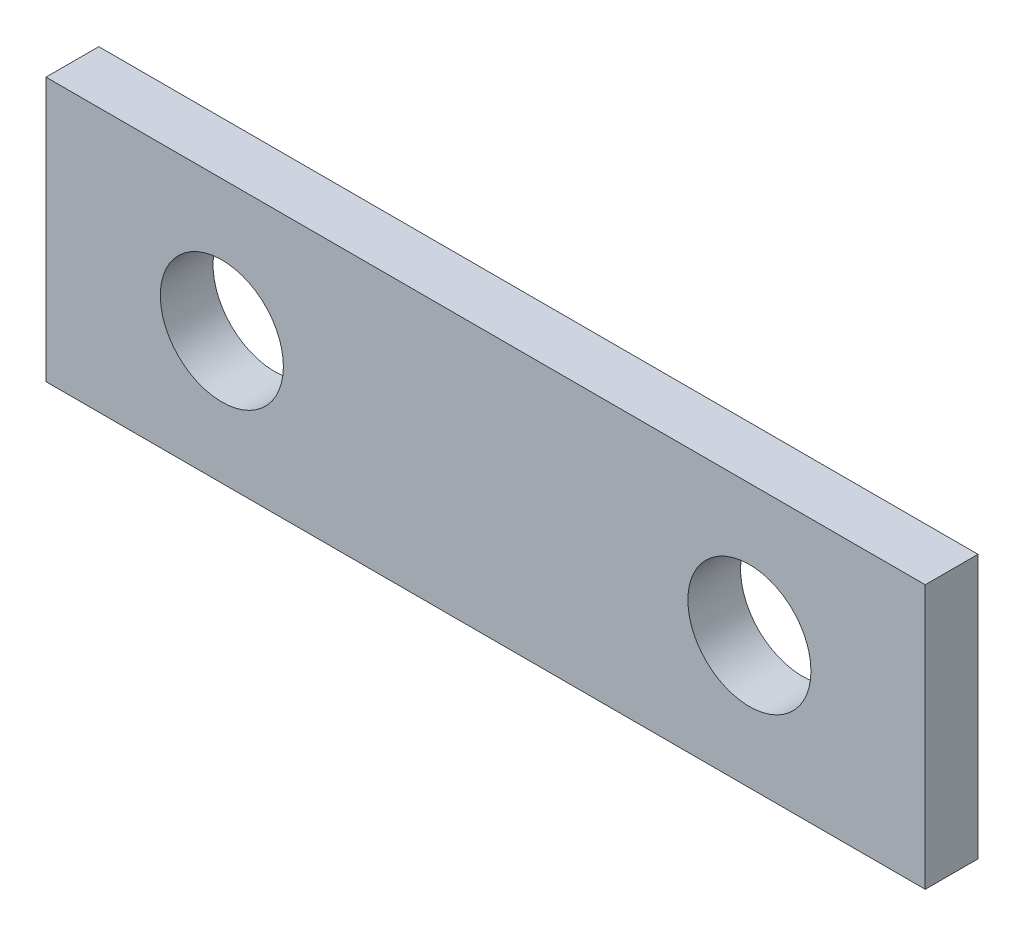
ISO-10303-21;
HEADER;
FILE_DESCRIPTION(('STEP AP214'),'2;1');
FILE_NAME('part.step','',(''),(''),'','','');
FILE_SCHEMA(('AUTOMOTIVE_DESIGN { 1 0 10303 214 1 1 1 1 }'));
ENDSEC;
DATA;
#1=APPLICATION_CONTEXT('core data for automotive mechanical design processes');
#2=APPLICATION_PROTOCOL_DEFINITION('international standard','automotive_design',2000,#1);
#3=PRODUCT_CONTEXT('',#1,'mechanical');
#4=PRODUCT('Part','Part','',(#3));
#5=PRODUCT_RELATED_PRODUCT_CATEGORY('part','',(#4));
#6=PRODUCT_DEFINITION_FORMATION('','',#4);
#7=PRODUCT_DEFINITION_CONTEXT('part definition',#1,'design');
#8=PRODUCT_DEFINITION('design','',#6,#7);
#9=PRODUCT_DEFINITION_SHAPE('','',#8);
#10=(LENGTH_UNIT() NAMED_UNIT(*) SI_UNIT(.MILLI.,.METRE.));
#11=(NAMED_UNIT(*) PLANE_ANGLE_UNIT() SI_UNIT($,.RADIAN.));
#12=(NAMED_UNIT(*) SI_UNIT($,.STERADIAN.) SOLID_ANGLE_UNIT());
#13=UNCERTAINTY_MEASURE_WITH_UNIT(LENGTH_MEASURE(1.E-05),#10,'distance_accuracy_value','');
#14=(GEOMETRIC_REPRESENTATION_CONTEXT(3) GLOBAL_UNCERTAINTY_ASSIGNED_CONTEXT((#13)) GLOBAL_UNIT_ASSIGNED_CONTEXT((#10,
#11,#12)) REPRESENTATION_CONTEXT('',''));
#15=CARTESIAN_POINT('',(0.,0.,0.));
#16=DIRECTION('',(0.,0.,1.));
#17=DIRECTION('',(1.,0.,0.));
#18=AXIS2_PLACEMENT_3D('',#15,#16,#17);
#19=CARTESIAN_POINT('',(0.,0.,6.));
#20=DIRECTION('',(0.,0.,-1.));
#21=DIRECTION('',(-1.,0.,0.));
#22=AXIS2_PLACEMENT_3D('',#19,#20,#21);
#23=PLANE('',#22);
#24=CARTESIAN_POINT('',(20.,15.,6.));
#25=DIRECTION('',(0.,0.,1.));
#26=DIRECTION('',(1.,0.,0.));
#27=AXIS2_PLACEMENT_3D('',#24,#25,#26);
#28=CIRCLE('',#27,7.);
#29=CARTESIAN_POINT('',(27.,15.,6.));
#30=VERTEX_POINT('',#29);
#31=EDGE_CURVE('E99',#30,#30,#28,.T.);
#32=ORIENTED_EDGE('',*,*,#31,.F.);
#33=EDGE_LOOP('',(#32));
#34=FACE_BOUND('',#33,.T.);
#35=DIRECTION('',(0.,-1.,0.));
#36=VECTOR('',#35,1.);
#37=CARTESIAN_POINT('',(0.,0.,6.));
#38=LINE('',#37,#36);
#39=CARTESIAN_POINT('',(0.,30.,6.));
#40=VERTEX_POINT('',#39);
#41=CARTESIAN_POINT('',(0.,0.,6.));
#42=VERTEX_POINT('',#41);
#43=EDGE_CURVE('E84',#40,#42,#38,.T.);
#44=ORIENTED_EDGE('',*,*,#43,.T.);
#45=DIRECTION('',(1.,0.,0.));
#46=VECTOR('',#45,1.);
#47=CARTESIAN_POINT('',(0.,0.,6.));
#48=LINE('',#47,#46);
#49=CARTESIAN_POINT('',(100.,0.,6.));
#50=VERTEX_POINT('',#49);
#51=EDGE_CURVE('E79',#42,#50,#48,.T.);
#52=ORIENTED_EDGE('',*,*,#51,.T.);
#53=DIRECTION('',(0.,1.,0.));
#54=VECTOR('',#53,1.);
#55=CARTESIAN_POINT('',(100.,0.,6.));
#56=LINE('',#55,#54);
#57=CARTESIAN_POINT('',(100.,30.,6.));
#58=VERTEX_POINT('',#57);
#59=EDGE_CURVE('E82',#50,#58,#56,.T.);
#60=ORIENTED_EDGE('',*,*,#59,.T.);
#61=DIRECTION('',(-1.,0.,0.));
#62=VECTOR('',#61,1.);
#63=CARTESIAN_POINT('',(0.,30.,6.));
#64=LINE('',#63,#62);
#65=EDGE_CURVE('E49',#58,#40,#64,.T.);
#66=ORIENTED_EDGE('',*,*,#65,.T.);
#67=EDGE_LOOP('',(#44,#52,#60,#66));
#68=FACE_BOUND('',#67,.T.);
#69=CARTESIAN_POINT('',(80.,15.,6.));
#70=DIRECTION('',(0.,0.,1.));
#71=DIRECTION('',(1.,0.,0.));
#72=AXIS2_PLACEMENT_3D('',#69,#70,#71);
#73=CIRCLE('',#72,7.);
#74=CARTESIAN_POINT('',(87.,15.,6.));
#75=VERTEX_POINT('',#74);
#76=EDGE_CURVE('E114',#75,#75,#73,.T.);
#77=ORIENTED_EDGE('',*,*,#76,.F.);
#78=EDGE_LOOP('',(#77));
#79=FACE_BOUND('',#78,.T.);
#80=ADVANCED_FACE('F32',(#34,#68,#79),#23,.F.);
#81=CARTESIAN_POINT('',(0.,0.,0.));
#82=DIRECTION('',(0.,0.,-1.));
#83=DIRECTION('',(-1.,0.,0.));
#84=AXIS2_PLACEMENT_3D('',#81,#82,#83);
#85=PLANE('',#84);
#86=CARTESIAN_POINT('',(20.,15.,0.));
#87=DIRECTION('',(0.,0.,1.));
#88=DIRECTION('',(1.,0.,0.));
#89=AXIS2_PLACEMENT_3D('',#86,#87,#88);
#90=CIRCLE('',#89,7.);
#91=CARTESIAN_POINT('',(27.,15.,0.));
#92=VERTEX_POINT('',#91);
#93=EDGE_CURVE('E111',#92,#92,#90,.T.);
#94=ORIENTED_EDGE('',*,*,#93,.T.);
#95=EDGE_LOOP('',(#94));
#96=FACE_BOUND('',#95,.T.);
#97=DIRECTION('',(0.,-1.,0.));
#98=VECTOR('',#97,1.);
#99=CARTESIAN_POINT('',(0.,0.,0.));
#100=LINE('',#99,#98);
#101=CARTESIAN_POINT('',(0.,30.,0.));
#102=VERTEX_POINT('',#101);
#103=CARTESIAN_POINT('',(0.,0.,0.));
#104=VERTEX_POINT('',#103);
#105=EDGE_CURVE('E96',#102,#104,#100,.T.);
#106=ORIENTED_EDGE('',*,*,#105,.F.);
#107=DIRECTION('',(-1.,0.,0.));
#108=VECTOR('',#107,1.);
#109=CARTESIAN_POINT('',(0.,30.,0.));
#110=LINE('',#109,#108);
#111=CARTESIAN_POINT('',(100.,30.,0.));
#112=VERTEX_POINT('',#111);
#113=EDGE_CURVE('E72',#112,#102,#110,.T.);
#114=ORIENTED_EDGE('',*,*,#113,.F.);
#115=DIRECTION('',(0.,1.,0.));
#116=VECTOR('',#115,1.);
#117=CARTESIAN_POINT('',(100.,0.,0.));
#118=LINE('',#117,#116);
#119=CARTESIAN_POINT('',(100.,0.,0.));
#120=VERTEX_POINT('',#119);
#121=EDGE_CURVE('E66',#120,#112,#118,.T.);
#122=ORIENTED_EDGE('',*,*,#121,.F.);
#123=DIRECTION('',(1.,0.,0.));
#124=VECTOR('',#123,1.);
#125=CARTESIAN_POINT('',(0.,0.,0.));
#126=LINE('',#125,#124);
#127=EDGE_CURVE('E88',#104,#120,#126,.T.);
#128=ORIENTED_EDGE('',*,*,#127,.F.);
#129=EDGE_LOOP('',(#106,#114,#122,#128));
#130=FACE_BOUND('',#129,.T.);
#131=CARTESIAN_POINT('',(80.,15.,0.));
#132=DIRECTION('',(0.,0.,1.));
#133=DIRECTION('',(1.,0.,0.));
#134=AXIS2_PLACEMENT_3D('',#131,#132,#133);
#135=CIRCLE('',#134,7.);
#136=CARTESIAN_POINT('',(87.,15.,0.));
#137=VERTEX_POINT('',#136);
#138=EDGE_CURVE('E117',#137,#137,#135,.T.);
#139=ORIENTED_EDGE('',*,*,#138,.T.);
#140=EDGE_LOOP('',(#139));
#141=FACE_BOUND('',#140,.T.);
#142=ADVANCED_FACE('F107',(#96,#130,#141),#85,.T.);
#143=CARTESIAN_POINT('',(0.,0.,6.));
#144=DIRECTION('',(1.,0.,0.));
#145=DIRECTION('',(0.,0.,-1.));
#146=AXIS2_PLACEMENT_3D('',#143,#144,#145);
#147=PLANE('',#146);
#148=ORIENTED_EDGE('',*,*,#105,.T.);
#149=DIRECTION('',(0.,0.,-1.));
#150=VECTOR('',#149,1.);
#151=CARTESIAN_POINT('',(0.,0.,6.));
#152=LINE('',#151,#150);
#153=EDGE_CURVE('E11',#42,#104,#152,.T.);
#154=ORIENTED_EDGE('',*,*,#153,.F.);
#155=ORIENTED_EDGE('',*,*,#43,.F.);
#156=DIRECTION('',(0.,0.,-1.));
#157=VECTOR('',#156,1.);
#158=CARTESIAN_POINT('',(0.,30.,6.));
#159=LINE('',#158,#157);
#160=EDGE_CURVE('E92',#40,#102,#159,.T.);
#161=ORIENTED_EDGE('',*,*,#160,.T.);
#162=EDGE_LOOP('',(#148,#154,#155,#161));
#163=FACE_BOUND('',#162,.T.);
#164=ADVANCED_FACE('F34',(#163),#147,.F.);
#165=CARTESIAN_POINT('',(0.,0.,6.));
#166=DIRECTION('',(0.,1.,0.));
#167=DIRECTION('',(0.,0.,1.));
#168=AXIS2_PLACEMENT_3D('',#165,#166,#167);
#169=PLANE('',#168);
#170=ORIENTED_EDGE('',*,*,#127,.T.);
#171=DIRECTION('',(0.,0.,-1.));
#172=VECTOR('',#171,1.);
#173=CARTESIAN_POINT('',(100.,0.,6.));
#174=LINE('',#173,#172);
#175=EDGE_CURVE('E41',#50,#120,#174,.T.);
#176=ORIENTED_EDGE('',*,*,#175,.F.);
#177=ORIENTED_EDGE('',*,*,#51,.F.);
#178=ORIENTED_EDGE('',*,*,#153,.T.);
#179=EDGE_LOOP('',(#170,#176,#177,#178));
#180=FACE_BOUND('',#179,.T.);
#181=ADVANCED_FACE('F87',(#180),#169,.F.);
#182=CARTESIAN_POINT('',(100.,0.,6.));
#183=DIRECTION('',(-1.,0.,0.));
#184=DIRECTION('',(0.,0.,1.));
#185=AXIS2_PLACEMENT_3D('',#182,#183,#184);
#186=PLANE('',#185);
#187=ORIENTED_EDGE('',*,*,#121,.T.);
#188=DIRECTION('',(0.,0.,-1.));
#189=VECTOR('',#188,1.);
#190=CARTESIAN_POINT('',(100.,30.,6.));
#191=LINE('',#190,#189);
#192=EDGE_CURVE('E89',#58,#112,#191,.T.);
#193=ORIENTED_EDGE('',*,*,#192,.F.);
#194=ORIENTED_EDGE('',*,*,#59,.F.);
#195=ORIENTED_EDGE('',*,*,#175,.T.);
#196=EDGE_LOOP('',(#187,#193,#194,#195));
#197=FACE_BOUND('',#196,.T.);
#198=ADVANCED_FACE('F90',(#197),#186,.F.);
#199=CARTESIAN_POINT('',(0.,30.,6.));
#200=DIRECTION('',(0.,-1.,0.));
#201=DIRECTION('',(0.,0.,-1.));
#202=AXIS2_PLACEMENT_3D('',#199,#200,#201);
#203=PLANE('',#202);
#204=ORIENTED_EDGE('',*,*,#113,.T.);
#205=ORIENTED_EDGE('',*,*,#160,.F.);
#206=ORIENTED_EDGE('',*,*,#65,.F.);
#207=ORIENTED_EDGE('',*,*,#192,.T.);
#208=EDGE_LOOP('',(#204,#205,#206,#207));
#209=FACE_BOUND('',#208,.T.);
#210=ADVANCED_FACE('F104',(#209),#203,.F.);
#211=CARTESIAN_POINT('',(20.,15.,6.));
#212=DIRECTION('',(0.,0.,-1.));
#213=DIRECTION('',(-1.,0.,0.));
#214=AXIS2_PLACEMENT_3D('',#211,#212,#213);
#215=CYLINDRICAL_SURFACE('',#214,7.);
#216=ORIENTED_EDGE('',*,*,#31,.T.);
#217=EDGE_LOOP('',(#216));
#218=FACE_BOUND('',#217,.T.);
#219=ORIENTED_EDGE('',*,*,#93,.F.);
#220=EDGE_LOOP('',(#219));
#221=FACE_BOUND('',#220,.T.);
#222=ADVANCED_FACE('F135',(#218,#221),#215,.F.);
#223=CARTESIAN_POINT('',(80.,15.,6.));
#224=DIRECTION('',(0.,0.,-1.));
#225=DIRECTION('',(-1.,0.,0.));
#226=AXIS2_PLACEMENT_3D('',#223,#224,#225);
#227=CYLINDRICAL_SURFACE('',#226,7.);
#228=ORIENTED_EDGE('',*,*,#76,.T.);
#229=EDGE_LOOP('',(#228));
#230=FACE_BOUND('',#229,.T.);
#231=ORIENTED_EDGE('',*,*,#138,.F.);
#232=EDGE_LOOP('',(#231));
#233=FACE_BOUND('',#232,.T.);
#234=ADVANCED_FACE('F123',(#230,#233),#227,.F.);
#235=CLOSED_SHELL('',(#80,#142,#164,#181,#198,#210,#222,#234));
#236=MANIFOLD_SOLID_BREP('B2',#235);
#237=ADVANCED_BREP_SHAPE_REPRESENTATION('',(#18,#236),#14);
#238=SHAPE_DEFINITION_REPRESENTATION(#9,#237);
ENDSEC;
END-ISO-10303-21;
